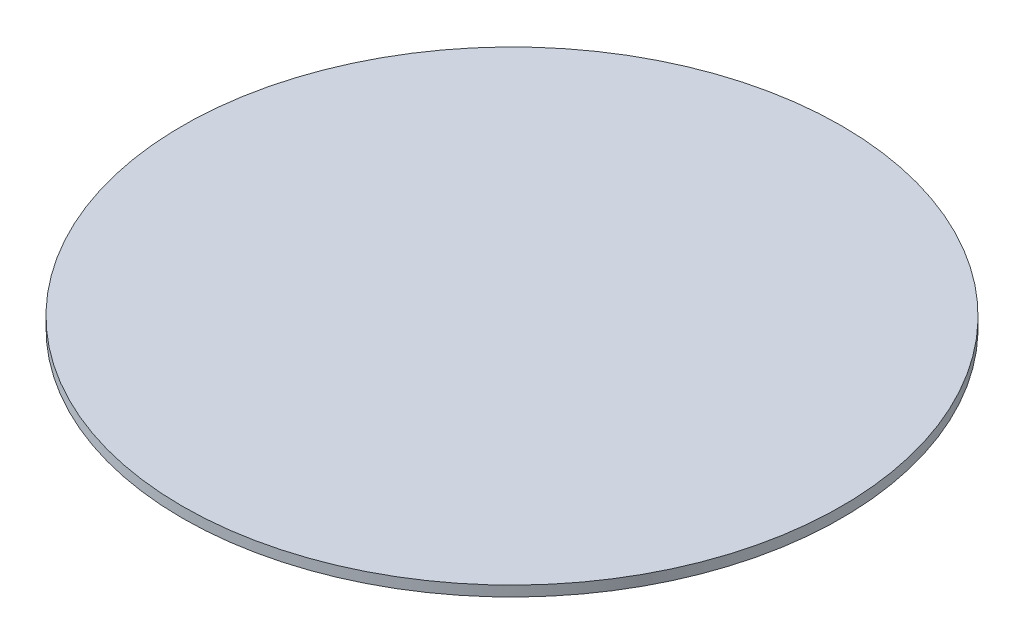
ISO-10303-21;
HEADER;
FILE_DESCRIPTION(('STEP AP214'),'2;1');
FILE_NAME('part.step','',(''),(''),'','','');
FILE_SCHEMA(('AUTOMOTIVE_DESIGN { 1 0 10303 214 1 1 1 1 }'));
ENDSEC;
DATA;
#1=APPLICATION_CONTEXT('core data for automotive mechanical design processes');
#2=APPLICATION_PROTOCOL_DEFINITION('international standard','automotive_design',2000,#1);
#3=PRODUCT_CONTEXT('',#1,'mechanical');
#4=PRODUCT('Part','Part','',(#3));
#5=PRODUCT_RELATED_PRODUCT_CATEGORY('part','',(#4));
#6=PRODUCT_DEFINITION_FORMATION('','',#4);
#7=PRODUCT_DEFINITION_CONTEXT('part definition',#1,'design');
#8=PRODUCT_DEFINITION('design','',#6,#7);
#9=PRODUCT_DEFINITION_SHAPE('','',#8);
#10=(LENGTH_UNIT() NAMED_UNIT(*) SI_UNIT(.MILLI.,.METRE.));
#11=(NAMED_UNIT(*) PLANE_ANGLE_UNIT() SI_UNIT($,.RADIAN.));
#12=(NAMED_UNIT(*) SI_UNIT($,.STERADIAN.) SOLID_ANGLE_UNIT());
#13=UNCERTAINTY_MEASURE_WITH_UNIT(LENGTH_MEASURE(1.E-05),#10,'distance_accuracy_value','');
#14=(GEOMETRIC_REPRESENTATION_CONTEXT(3) GLOBAL_UNCERTAINTY_ASSIGNED_CONTEXT((#13)) GLOBAL_UNIT_ASSIGNED_CONTEXT((#10,
#11,#12)) REPRESENTATION_CONTEXT('',''));
#15=CARTESIAN_POINT('',(0.,0.,0.));
#16=DIRECTION('',(0.,0.,1.));
#17=DIRECTION('',(1.,0.,0.));
#18=AXIS2_PLACEMENT_3D('',#15,#16,#17);
#19=CARTESIAN_POINT('',(0.,1.5,0.));
#20=DIRECTION('',(0.,-1.,0.));
#21=DIRECTION('',(0.,0.,-1.));
#22=AXIS2_PLACEMENT_3D('',#19,#20,#21);
#23=CYLINDRICAL_SURFACE('',#22,47.8);
#24=CARTESIAN_POINT('',(0.,1.5,0.));
#25=DIRECTION('',(0.,1.,0.));
#26=DIRECTION('',(0.,0.,1.));
#27=AXIS2_PLACEMENT_3D('',#24,#25,#26);
#28=CIRCLE('',#27,47.8);
#29=CARTESIAN_POINT('',(0.,1.5,47.8));
#30=VERTEX_POINT('',#29);
#31=EDGE_CURVE('E10',#30,#30,#28,.T.);
#32=ORIENTED_EDGE('',*,*,#31,.F.);
#33=EDGE_LOOP('',(#32));
#34=FACE_BOUND('',#33,.T.);
#35=CARTESIAN_POINT('',(0.,0.,0.));
#36=DIRECTION('',(0.,1.,0.));
#37=DIRECTION('',(0.,0.,1.));
#38=AXIS2_PLACEMENT_3D('',#35,#36,#37);
#39=CIRCLE('',#38,47.8);
#40=CARTESIAN_POINT('',(0.,0.,47.8));
#41=VERTEX_POINT('',#40);
#42=EDGE_CURVE('E40',#41,#41,#39,.T.);
#43=ORIENTED_EDGE('',*,*,#42,.T.);
#44=EDGE_LOOP('',(#43));
#45=FACE_BOUND('',#44,.T.);
#46=ADVANCED_FACE('F37',(#34,#45),#23,.T.);
#47=CARTESIAN_POINT('',(0.,1.5,0.));
#48=DIRECTION('',(0.,1.,0.));
#49=DIRECTION('',(0.,0.,1.));
#50=AXIS2_PLACEMENT_3D('',#47,#48,#49);
#51=PLANE('',#50);
#52=ORIENTED_EDGE('',*,*,#31,.T.);
#53=EDGE_LOOP('',(#52));
#54=FACE_BOUND('',#53,.T.);
#55=ADVANCED_FACE('F54',(#54),#51,.T.);
#56=CARTESIAN_POINT('',(0.,0.,0.));
#57=DIRECTION('',(0.,1.,0.));
#58=DIRECTION('',(0.,0.,1.));
#59=AXIS2_PLACEMENT_3D('',#56,#57,#58);
#60=PLANE('',#59);
#61=ORIENTED_EDGE('',*,*,#42,.F.);
#62=EDGE_LOOP('',(#61));
#63=FACE_BOUND('',#62,.T.);
#64=ADVANCED_FACE('F52',(#63),#60,.F.);
#65=CLOSED_SHELL('',(#46,#55,#64));
#66=MANIFOLD_SOLID_BREP('B2',#65);
#67=ADVANCED_BREP_SHAPE_REPRESENTATION('',(#18,#66),#14);
#68=SHAPE_DEFINITION_REPRESENTATION(#9,#67);
ENDSEC;
END-ISO-10303-21;
